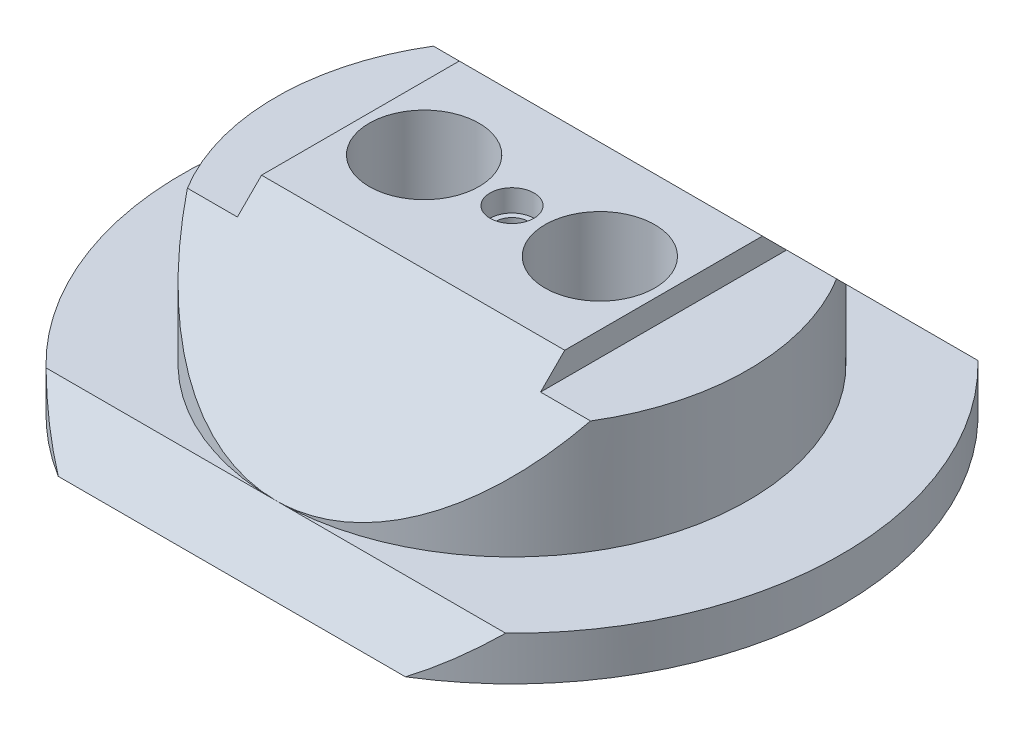
ISO-10303-21;
HEADER;
FILE_DESCRIPTION(('STEP AP214'),'2;1');
FILE_NAME('part.step','',(''),(''),'','','');
FILE_SCHEMA(('AUTOMOTIVE_DESIGN { 1 0 10303 214 1 1 1 1 }'));
ENDSEC;
DATA;
#1=APPLICATION_CONTEXT('core data for automotive mechanical design processes');
#2=APPLICATION_PROTOCOL_DEFINITION('international standard','automotive_design',2000,#1);
#3=PRODUCT_CONTEXT('',#1,'mechanical');
#4=PRODUCT('Part','Part','',(#3));
#5=PRODUCT_RELATED_PRODUCT_CATEGORY('part','',(#4));
#6=PRODUCT_DEFINITION_FORMATION('','',#4);
#7=PRODUCT_DEFINITION_CONTEXT('part definition',#1,'design');
#8=PRODUCT_DEFINITION('design','',#6,#7);
#9=PRODUCT_DEFINITION_SHAPE('','',#8);
#10=(LENGTH_UNIT() NAMED_UNIT(*) SI_UNIT(.MILLI.,.METRE.));
#11=(NAMED_UNIT(*) PLANE_ANGLE_UNIT() SI_UNIT($,.RADIAN.));
#12=(NAMED_UNIT(*) SI_UNIT($,.STERADIAN.) SOLID_ANGLE_UNIT());
#13=UNCERTAINTY_MEASURE_WITH_UNIT(LENGTH_MEASURE(1.E-05),#10,'distance_accuracy_value','');
#14=(GEOMETRIC_REPRESENTATION_CONTEXT(3) GLOBAL_UNCERTAINTY_ASSIGNED_CONTEXT((#13)) GLOBAL_UNIT_ASSIGNED_CONTEXT((#10,
#11,#12)) REPRESENTATION_CONTEXT('',''));
#15=CARTESIAN_POINT('',(0.,0.,0.));
#16=DIRECTION('',(0.,0.,1.));
#17=DIRECTION('',(1.,0.,0.));
#18=AXIS2_PLACEMENT_3D('',#15,#16,#17);
#19=CARTESIAN_POINT('',(0.,20.,0.));
#20=DIRECTION('',(0.,-1.,0.));
#21=DIRECTION('',(0.,0.,-1.));
#22=AXIS2_PLACEMENT_3D('',#19,#20,#21);
#23=CYLINDRICAL_SURFACE('',#22,1.5);
#24=CARTESIAN_POINT('',(0.,0.,0.));
#25=DIRECTION('',(0.,-1.,0.));
#26=DIRECTION('',(0.,0.,-1.));
#27=AXIS2_PLACEMENT_3D('',#24,#25,#26);
#28=CIRCLE('',#27,1.5);
#29=CARTESIAN_POINT('',(0.,0.,-1.5));
#30=VERTEX_POINT('',#29);
#31=EDGE_CURVE('E156',#30,#30,#28,.T.);
#32=ORIENTED_EDGE('',*,*,#31,.T.);
#33=EDGE_LOOP('',(#32));
#34=FACE_BOUND('',#33,.T.);
#35=CARTESIAN_POINT('',(0.,14.5,0.));
#36=DIRECTION('',(0.,1.,0.));
#37=DIRECTION('',(0.,0.,1.));
#38=AXIS2_PLACEMENT_3D('',#35,#36,#37);
#39=CIRCLE('',#38,1.5);
#40=CARTESIAN_POINT('',(0.,14.5,1.5));
#41=VERTEX_POINT('',#40);
#42=EDGE_CURVE('E60',#41,#41,#39,.F.);
#43=ORIENTED_EDGE('',*,*,#42,.F.);
#44=EDGE_LOOP('',(#43));
#45=FACE_BOUND('',#44,.T.);
#46=ADVANCED_FACE('F56',(#34,#45),#23,.F.);
#47=CARTESIAN_POINT('',(0.,0.,0.));
#48=DIRECTION('',(0.,1.,0.));
#49=DIRECTION('',(0.,0.,1.));
#50=AXIS2_PLACEMENT_3D('',#47,#48,#49);
#51=PLANE('',#50);
#52=ORIENTED_EDGE('',*,*,#31,.F.);
#53=EDGE_LOOP('',(#52));
#54=FACE_BOUND('',#53,.T.);
#55=CARTESIAN_POINT('',(-8.,0.,0.));
#56=DIRECTION('',(0.,1.,0.));
#57=DIRECTION('',(0.,0.,1.));
#58=AXIS2_PLACEMENT_3D('',#55,#56,#57);
#59=CIRCLE('',#58,5.);
#60=CARTESIAN_POINT('',(-8.,0.,5.));
#61=VERTEX_POINT('',#60);
#62=EDGE_CURVE('E196',#61,#61,#59,.T.);
#63=ORIENTED_EDGE('',*,*,#62,.T.);
#64=EDGE_LOOP('',(#63));
#65=FACE_BOUND('',#64,.T.);
#66=CARTESIAN_POINT('',(8.,0.,0.));
#67=DIRECTION('',(0.,1.,0.));
#68=DIRECTION('',(0.,0.,1.));
#69=AXIS2_PLACEMENT_3D('',#66,#67,#68);
#70=CIRCLE('',#69,5.);
#71=CARTESIAN_POINT('',(8.,0.,5.));
#72=VERTEX_POINT('',#71);
#73=EDGE_CURVE('E189',#72,#72,#70,.T.);
#74=ORIENTED_EDGE('',*,*,#73,.T.);
#75=EDGE_LOOP('',(#74));
#76=FACE_BOUND('',#75,.T.);
#77=DIRECTION('',(1.,0.,0.));
#78=VECTOR('',#77,1.);
#79=CARTESIAN_POINT('',(0.,0.,25.5));
#80=LINE('',#79,#78);
#81=CARTESIAN_POINT('',(-15.8034806292791,0.,25.5));
#82=VERTEX_POINT('',#81);
#83=CARTESIAN_POINT('',(15.8034806292791,0.,25.5));
#84=VERTEX_POINT('',#83);
#85=EDGE_CURVE('E219',#82,#84,#80,.T.);
#86=ORIENTED_EDGE('',*,*,#85,.F.);
#87=CARTESIAN_POINT('',(0.,0.,0.));
#88=DIRECTION('',(0.,1.,0.));
#89=DIRECTION('',(0.,0.,1.));
#90=AXIS2_PLACEMENT_3D('',#87,#88,#89);
#91=CIRCLE('',#90,30.);
#92=CARTESIAN_POINT('',(-15.8034806292789,0.,-25.5000000000001));
#93=VERTEX_POINT('',#92);
#94=EDGE_CURVE('E249',#93,#82,#91,.T.);
#95=ORIENTED_EDGE('',*,*,#94,.F.);
#96=DIRECTION('',(-1.,0.,0.));
#97=VECTOR('',#96,1.);
#98=CARTESIAN_POINT('',(0.,0.,-25.5000000000001));
#99=LINE('',#98,#97);
#100=CARTESIAN_POINT('',(15.8034806292789,0.,-25.5000000000001));
#101=VERTEX_POINT('',#100);
#102=EDGE_CURVE('E223',#101,#93,#99,.T.);
#103=ORIENTED_EDGE('',*,*,#102,.F.);
#104=EDGE_CURVE('E238',#84,#101,#91,.T.);
#105=ORIENTED_EDGE('',*,*,#104,.F.);
#106=EDGE_LOOP('',(#86,#95,#103,#105));
#107=FACE_BOUND('',#106,.T.);
#108=ADVANCED_FACE('F306',(#54,#65,#76,#107),#51,.F.);
#109=CARTESIAN_POINT('',(0.,4.,0.));
#110=DIRECTION('',(0.,-1.,0.));
#111=DIRECTION('',(0.,0.,-1.));
#112=AXIS2_PLACEMENT_3D('',#109,#110,#111);
#113=CYLINDRICAL_SURFACE('',#112,30.);
#114=CARTESIAN_POINT('',(0.,4.,0.));
#115=DIRECTION('',(0.,1.,0.));
#116=DIRECTION('',(0.,0.,1.));
#117=AXIS2_PLACEMENT_3D('',#114,#115,#116);
#118=CIRCLE('',#117,30.);
#119=CARTESIAN_POINT('',(20.9224759529077,4.,21.5));
#120=VERTEX_POINT('',#119);
#121=CARTESIAN_POINT('',(20.9224759529077,4.,-21.5));
#122=VERTEX_POINT('',#121);
#123=EDGE_CURVE('E212',#120,#122,#118,.T.);
#124=ORIENTED_EDGE('',*,*,#123,.F.);
#125=CARTESIAN_POINT('',(0.,25.4999999999998,0.));
#126=DIRECTION('',(0.,-0.707106781186551,-0.707106781186544));
#127=DIRECTION('',(0.,-0.707106781186544,0.707106781186551));
#128=AXIS2_PLACEMENT_3D('',#125,#126,#127);
#129=ELLIPSE('',#128,42.4264068711926,30.);
#130=EDGE_CURVE('E239',#84,#120,#129,.F.);
#131=ORIENTED_EDGE('',*,*,#130,.F.);
#132=ORIENTED_EDGE('',*,*,#104,.T.);
#133=CARTESIAN_POINT('',(0.,25.4999999999995,0.));
#134=DIRECTION('',(0.,-0.707106781186556,0.707106781186539));
#135=DIRECTION('',(0.,-0.707106781186539,-0.707106781186556));
#136=AXIS2_PLACEMENT_3D('',#133,#134,#135);
#137=ELLIPSE('',#136,42.4264068711924,30.);
#138=EDGE_CURVE('E235',#122,#101,#137,.F.);
#139=ORIENTED_EDGE('',*,*,#138,.F.);
#140=EDGE_LOOP('',(#124,#131,#132,#139));
#141=FACE_BOUND('',#140,.T.);
#142=ADVANCED_FACE('F58',(#141),#113,.T.);
#143=CARTESIAN_POINT('',(0.,4.,0.));
#144=DIRECTION('',(0.,1.,0.));
#145=DIRECTION('',(0.,0.,1.));
#146=AXIS2_PLACEMENT_3D('',#143,#144,#145);
#147=CIRCLE('',#146,30.);
#148=CARTESIAN_POINT('',(-20.9224759529077,4.,-21.5));
#149=VERTEX_POINT('',#148);
#150=CARTESIAN_POINT('',(-20.9224759529077,4.,21.5));
#151=VERTEX_POINT('',#150);
#152=EDGE_CURVE('E209',#149,#151,#147,.T.);
#153=ORIENTED_EDGE('',*,*,#152,.F.);
#154=CARTESIAN_POINT('',(0.,25.4999999999995,0.));
#155=DIRECTION('',(0.,0.707106781186556,-0.707106781186539));
#156=DIRECTION('',(0.,-0.707106781186539,-0.707106781186556));
#157=AXIS2_PLACEMENT_3D('',#154,#155,#156);
#158=ELLIPSE('',#157,42.4264068711924,30.);
#159=EDGE_CURVE('E227',#149,#93,#158,.F.);
#160=ORIENTED_EDGE('',*,*,#159,.T.);
#161=ORIENTED_EDGE('',*,*,#94,.T.);
#162=CARTESIAN_POINT('',(0.,25.4999999999998,0.));
#163=DIRECTION('',(0.,0.707106781186551,0.707106781186544));
#164=DIRECTION('',(0.,-0.707106781186544,0.707106781186551));
#165=AXIS2_PLACEMENT_3D('',#162,#163,#164);
#166=ELLIPSE('',#165,42.4264068711926,30.);
#167=EDGE_CURVE('E230',#82,#151,#166,.F.);
#168=ORIENTED_EDGE('',*,*,#167,.T.);
#169=EDGE_LOOP('',(#153,#160,#161,#168));
#170=FACE_BOUND('',#169,.T.);
#171=ADVANCED_FACE('F315',(#170),#113,.T.);
#172=CARTESIAN_POINT('',(30.001,16.5,8.99999999999987));
#173=DIRECTION('',(0.,-0.707106781186551,-0.707106781186544));
#174=DIRECTION('',(0.,0.707106781186544,-0.707106781186551));
#175=AXIS2_PLACEMENT_3D('',#172,#173,#174);
#176=PLANE('',#175);
#177=DIRECTION('',(1.,0.,0.));
#178=VECTOR('',#177,1.);
#179=CARTESIAN_POINT('',(30.001,4.,21.5));
#180=LINE('',#179,#178);
#181=CARTESIAN_POINT('',(0.,3.99999999999999,21.5));
#182=VERTEX_POINT('',#181);
#183=EDGE_CURVE('E218',#151,#182,#180,.T.);
#184=ORIENTED_EDGE('',*,*,#183,.F.);
#185=ORIENTED_EDGE('',*,*,#167,.F.);
#186=ORIENTED_EDGE('',*,*,#85,.T.);
#187=ORIENTED_EDGE('',*,*,#130,.T.);
#188=EDGE_CURVE('E215',#182,#120,#180,.T.);
#189=ORIENTED_EDGE('',*,*,#188,.F.);
#190=EDGE_LOOP('',(#184,#185,#186,#187,#189));
#191=FACE_BOUND('',#190,.T.);
#192=ADVANCED_FACE('F298',(#191),#176,.F.);
#193=CARTESIAN_POINT('',(30.001,16.5,-8.99999999999971));
#194=DIRECTION('',(0.,-0.707106781186556,0.707106781186539));
#195=DIRECTION('',(0.,-0.707106781186539,-0.707106781186556));
#196=AXIS2_PLACEMENT_3D('',#193,#194,#195);
#197=PLANE('',#196);
#198=DIRECTION('',(-1.,0.,0.));
#199=VECTOR('',#198,1.);
#200=CARTESIAN_POINT('',(30.001,4.,-21.5));
#201=LINE('',#200,#199);
#202=CARTESIAN_POINT('',(0.,4.,-21.5));
#203=VERTEX_POINT('',#202);
#204=EDGE_CURVE('E259',#122,#203,#201,.T.);
#205=ORIENTED_EDGE('',*,*,#204,.F.);
#206=ORIENTED_EDGE('',*,*,#138,.T.);
#207=ORIENTED_EDGE('',*,*,#102,.T.);
#208=ORIENTED_EDGE('',*,*,#159,.F.);
#209=EDGE_CURVE('E256',#203,#149,#201,.T.);
#210=ORIENTED_EDGE('',*,*,#209,.F.);
#211=EDGE_LOOP('',(#205,#206,#207,#208,#210));
#212=FACE_BOUND('',#211,.T.);
#213=ADVANCED_FACE('F313',(#212),#197,.F.);
#214=CARTESIAN_POINT('',(0.,96.0338927753446,0.));
#215=DIRECTION('',(0.,-1.,0.));
#216=DIRECTION('',(0.,0.,-1.));
#217=AXIS2_PLACEMENT_3D('',#214,#215,#216);
#218=CYLINDRICAL_SURFACE('',#217,21.5);
#219=CARTESIAN_POINT('',(0.,14.3,0.));
#220=DIRECTION('',(0.,-1.,0.));
#221=DIRECTION('',(1.,0.,0.));
#222=AXIS2_PLACEMENT_3D('',#219,#220,#221);
#223=CIRCLE('',#222,21.5);
#224=CARTESIAN_POINT('',(18.3523840413175,14.3,-11.1999999999998));
#225=VERTEX_POINT('',#224);
#226=CARTESIAN_POINT('',(18.3523840413174,14.3,11.1999999999999));
#227=VERTEX_POINT('',#226);
#228=EDGE_CURVE('E177',#225,#227,#223,.T.);
#229=ORIENTED_EDGE('',*,*,#228,.T.);
#230=CARTESIAN_POINT('',(0.,25.4999999999998,0.));
#231=DIRECTION('',(0.,-0.707106781186551,-0.707106781186544));
#232=DIRECTION('',(0.,-0.707106781186544,0.707106781186551));
#233=AXIS2_PLACEMENT_3D('',#230,#231,#232);
#234=ELLIPSE('',#233,30.4055915910214,21.5);
#235=EDGE_CURVE('E208',#182,#227,#234,.F.);
#236=ORIENTED_EDGE('',*,*,#235,.F.);
#237=CARTESIAN_POINT('',(0.,4.,0.));
#238=DIRECTION('',(0.,1.,0.));
#239=DIRECTION('',(0.,0.,1.));
#240=AXIS2_PLACEMENT_3D('',#237,#238,#239);
#241=CIRCLE('',#240,21.5);
#242=EDGE_CURVE('E201',#182,#203,#241,.T.);
#243=ORIENTED_EDGE('',*,*,#242,.T.);
#244=CARTESIAN_POINT('',(0.,25.4999999999995,0.));
#245=DIRECTION('',(0.,-0.707106781186556,0.707106781186539));
#246=DIRECTION('',(0.,-0.707106781186539,-0.707106781186556));
#247=AXIS2_PLACEMENT_3D('',#244,#245,#246);
#248=ELLIPSE('',#247,30.4055915910212,21.5);
#249=EDGE_CURVE('E253',#225,#203,#248,.F.);
#250=ORIENTED_EDGE('',*,*,#249,.F.);
#251=EDGE_LOOP('',(#229,#236,#243,#250));
#252=FACE_BOUND('',#251,.T.);
#253=ADVANCED_FACE('F289',(#252),#218,.T.);
#254=CARTESIAN_POINT('',(0.,4.,0.));
#255=DIRECTION('',(0.,1.,0.));
#256=DIRECTION('',(0.,0.,1.));
#257=AXIS2_PLACEMENT_3D('',#254,#255,#256);
#258=PLANE('',#257);
#259=ORIENTED_EDGE('',*,*,#188,.T.);
#260=ORIENTED_EDGE('',*,*,#123,.T.);
#261=ORIENTED_EDGE('',*,*,#204,.T.);
#262=ORIENTED_EDGE('',*,*,#242,.F.);
#263=EDGE_LOOP('',(#259,#260,#261,#262));
#264=FACE_BOUND('',#263,.T.);
#265=ADVANCED_FACE('F295',(#264),#258,.T.);
#266=ORIENTED_EDGE('',*,*,#183,.T.);
#267=EDGE_CURVE('E200',#203,#182,#241,.T.);
#268=ORIENTED_EDGE('',*,*,#267,.F.);
#269=ORIENTED_EDGE('',*,*,#209,.T.);
#270=ORIENTED_EDGE('',*,*,#152,.T.);
#271=EDGE_LOOP('',(#266,#268,#269,#270));
#272=FACE_BOUND('',#271,.T.);
#273=ADVANCED_FACE('F282',(#272),#258,.T.);
#274=CARTESIAN_POINT('',(-18.3523840413174,14.3,11.1999999999999));
#275=VERTEX_POINT('',#274);
#276=EDGE_CURVE('E205',#275,#182,#234,.F.);
#277=ORIENTED_EDGE('',*,*,#276,.F.);
#278=CARTESIAN_POINT('',(0.,14.3,0.));
#279=DIRECTION('',(0.,-1.,0.));
#280=DIRECTION('',(0.,0.,-1.));
#281=AXIS2_PLACEMENT_3D('',#278,#279,#280);
#282=CIRCLE('',#281,21.5);
#283=CARTESIAN_POINT('',(-18.3523840413175,14.3,-11.1999999999998));
#284=VERTEX_POINT('',#283);
#285=EDGE_CURVE('E73',#275,#284,#282,.T.);
#286=ORIENTED_EDGE('',*,*,#285,.T.);
#287=EDGE_CURVE('E161',#203,#284,#248,.F.);
#288=ORIENTED_EDGE('',*,*,#287,.F.);
#289=ORIENTED_EDGE('',*,*,#267,.T.);
#290=EDGE_LOOP('',(#277,#286,#288,#289));
#291=FACE_BOUND('',#290,.T.);
#292=ADVANCED_FACE('F274',(#291),#218,.T.);
#293=DIRECTION('',(1.,0.,0.));
#294=VECTOR('',#293,1.);
#295=CARTESIAN_POINT('',(30.001,14.3,-11.1999999999998));
#296=LINE('',#295,#294);
#297=CARTESIAN_POINT('',(-13.8,14.3,-11.1999999999998));
#298=VERTEX_POINT('',#297);
#299=EDGE_CURVE('E152',#284,#298,#296,.T.);
#300=ORIENTED_EDGE('',*,*,#299,.T.);
#301=DIRECTION('',(0.,0.707106781186539,0.707106781186556));
#302=VECTOR('',#301,1.);
#303=CARTESIAN_POINT('',(-13.8,16.5,-8.99999999999971));
#304=LINE('',#303,#302);
#305=CARTESIAN_POINT('',(-13.8,16.5,-8.99999999999971));
#306=VERTEX_POINT('',#305);
#307=EDGE_CURVE('E141',#298,#306,#304,.T.);
#308=ORIENTED_EDGE('',*,*,#307,.T.);
#309=DIRECTION('',(-1.,0.,0.));
#310=VECTOR('',#309,1.);
#311=CARTESIAN_POINT('',(30.001,16.5,-8.99999999999971));
#312=LINE('',#311,#310);
#313=CARTESIAN_POINT('',(13.8,16.5,-8.99999999999971));
#314=VERTEX_POINT('',#313);
#315=EDGE_CURVE('E243',#314,#306,#312,.T.);
#316=ORIENTED_EDGE('',*,*,#315,.F.);
#317=DIRECTION('',(0.,-0.707106781186539,-0.707106781186556));
#318=VECTOR('',#317,1.);
#319=CARTESIAN_POINT('',(13.8,16.5,-8.99999999999971));
#320=LINE('',#319,#318);
#321=CARTESIAN_POINT('',(13.8,14.3,-11.1999999999998));
#322=VERTEX_POINT('',#321);
#323=EDGE_CURVE('E171',#314,#322,#320,.T.);
#324=ORIENTED_EDGE('',*,*,#323,.T.);
#325=DIRECTION('',(1.,0.,0.));
#326=VECTOR('',#325,1.);
#327=CARTESIAN_POINT('',(30.001,14.3,-11.1999999999998));
#328=LINE('',#327,#326);
#329=EDGE_CURVE('E180',#322,#225,#328,.T.);
#330=ORIENTED_EDGE('',*,*,#329,.T.);
#331=ORIENTED_EDGE('',*,*,#249,.T.);
#332=ORIENTED_EDGE('',*,*,#287,.T.);
#333=EDGE_LOOP('',(#300,#308,#316,#324,#330,#331,#332));
#334=FACE_BOUND('',#333,.T.);
#335=ADVANCED_FACE('F159',(#334),#197,.F.);
#336=CARTESIAN_POINT('',(30.001,16.5,8.99999999999987));
#337=DIRECTION('',(0.,-1.,0.));
#338=DIRECTION('',(0.,0.,-1.));
#339=AXIS2_PLACEMENT_3D('',#336,#337,#338);
#340=PLANE('',#339);
#341=CARTESIAN_POINT('',(0.,16.5,0.));
#342=DIRECTION('',(0.,1.,0.));
#343=DIRECTION('',(0.,0.,1.));
#344=AXIS2_PLACEMENT_3D('',#341,#342,#343);
#345=CIRCLE('',#344,2.);
#346=CARTESIAN_POINT('',(0.,16.5,2.00000000000001));
#347=VERTEX_POINT('',#346);
#348=EDGE_CURVE('E466',#347,#347,#345,.T.);
#349=ORIENTED_EDGE('',*,*,#348,.F.);
#350=EDGE_LOOP('',(#349));
#351=FACE_BOUND('',#350,.T.);
#352=CARTESIAN_POINT('',(-8.,16.5,0.));
#353=DIRECTION('',(0.,1.,0.));
#354=DIRECTION('',(0.,0.,1.));
#355=AXIS2_PLACEMENT_3D('',#352,#353,#354);
#356=CIRCLE('',#355,5.);
#357=CARTESIAN_POINT('',(-8.,16.5,5.00000000000001));
#358=VERTEX_POINT('',#357);
#359=EDGE_CURVE('E185',#358,#358,#356,.T.);
#360=ORIENTED_EDGE('',*,*,#359,.F.);
#361=EDGE_LOOP('',(#360));
#362=FACE_BOUND('',#361,.T.);
#363=CARTESIAN_POINT('',(8.,16.5,0.));
#364=DIRECTION('',(0.,1.,0.));
#365=DIRECTION('',(0.,0.,1.));
#366=AXIS2_PLACEMENT_3D('',#363,#364,#365);
#367=CIRCLE('',#366,5.);
#368=CARTESIAN_POINT('',(8.,16.5,5.));
#369=VERTEX_POINT('',#368);
#370=EDGE_CURVE('E184',#369,#369,#367,.T.);
#371=ORIENTED_EDGE('',*,*,#370,.F.);
#372=EDGE_LOOP('',(#371));
#373=FACE_BOUND('',#372,.T.);
#374=ORIENTED_EDGE('',*,*,#315,.T.);
#375=DIRECTION('',(0.,0.,1.));
#376=VECTOR('',#375,1.);
#377=CARTESIAN_POINT('',(-13.8,16.5,-25.5000000000001));
#378=LINE('',#377,#376);
#379=CARTESIAN_POINT('',(-13.8,16.5,8.99999999999986));
#380=VERTEX_POINT('',#379);
#381=EDGE_CURVE('E146',#306,#380,#378,.T.);
#382=ORIENTED_EDGE('',*,*,#381,.T.);
#383=DIRECTION('',(-1.,0.,0.));
#384=VECTOR('',#383,1.);
#385=CARTESIAN_POINT('',(30.001,16.5,8.99999999999987));
#386=LINE('',#385,#384);
#387=CARTESIAN_POINT('',(13.8,16.5,8.99999999999987));
#388=VERTEX_POINT('',#387);
#389=EDGE_CURVE('E234',#388,#380,#386,.T.);
#390=ORIENTED_EDGE('',*,*,#389,.F.);
#391=DIRECTION('',(0.,0.,1.));
#392=VECTOR('',#391,1.);
#393=CARTESIAN_POINT('',(13.8,16.5,-25.5000000000001));
#394=LINE('',#393,#392);
#395=EDGE_CURVE('E81',#314,#388,#394,.T.);
#396=ORIENTED_EDGE('',*,*,#395,.F.);
#397=EDGE_LOOP('',(#374,#382,#390,#396));
#398=FACE_BOUND('',#397,.T.);
#399=ADVANCED_FACE('F360',(#351,#362,#373,#398),#340,.F.);
#400=ORIENTED_EDGE('',*,*,#389,.T.);
#401=DIRECTION('',(0.,-0.707106781186544,0.707106781186551));
#402=VECTOR('',#401,1.);
#403=CARTESIAN_POINT('',(-13.8,16.5,8.99999999999987));
#404=LINE('',#403,#402);
#405=CARTESIAN_POINT('',(-13.8,14.3,11.1999999999999));
#406=VERTEX_POINT('',#405);
#407=EDGE_CURVE('E13',#380,#406,#404,.T.);
#408=ORIENTED_EDGE('',*,*,#407,.T.);
#409=DIRECTION('',(-1.,0.,0.));
#410=VECTOR('',#409,1.);
#411=CARTESIAN_POINT('',(30.001,14.3,11.1999999999999));
#412=LINE('',#411,#410);
#413=EDGE_CURVE('E66',#406,#275,#412,.T.);
#414=ORIENTED_EDGE('',*,*,#413,.T.);
#415=ORIENTED_EDGE('',*,*,#276,.T.);
#416=ORIENTED_EDGE('',*,*,#235,.T.);
#417=DIRECTION('',(-1.,0.,0.));
#418=VECTOR('',#417,1.);
#419=CARTESIAN_POINT('',(30.001,14.3,11.1999999999999));
#420=LINE('',#419,#418);
#421=CARTESIAN_POINT('',(13.8,14.3,11.1999999999999));
#422=VERTEX_POINT('',#421);
#423=EDGE_CURVE('E263',#227,#422,#420,.T.);
#424=ORIENTED_EDGE('',*,*,#423,.T.);
#425=DIRECTION('',(0.,0.707106781186544,-0.707106781186551));
#426=VECTOR('',#425,1.);
#427=CARTESIAN_POINT('',(13.8,16.5,8.99999999999987));
#428=LINE('',#427,#426);
#429=EDGE_CURVE('E260',#422,#388,#428,.T.);
#430=ORIENTED_EDGE('',*,*,#429,.T.);
#431=EDGE_LOOP('',(#400,#408,#414,#415,#416,#424,#430));
#432=FACE_BOUND('',#431,.T.);
#433=ADVANCED_FACE('F270',(#432),#176,.F.);
#434=CARTESIAN_POINT('',(8.,-7.50000000000001,0.));
#435=DIRECTION('',(0.,1.,0.));
#436=DIRECTION('',(0.,0.,1.));
#437=AXIS2_PLACEMENT_3D('',#434,#435,#436);
#438=CYLINDRICAL_SURFACE('',#437,5.);
#439=ORIENTED_EDGE('',*,*,#370,.T.);
#440=EDGE_LOOP('',(#439));
#441=FACE_BOUND('',#440,.T.);
#442=ORIENTED_EDGE('',*,*,#73,.F.);
#443=EDGE_LOOP('',(#442));
#444=FACE_BOUND('',#443,.T.);
#445=ADVANCED_FACE('F350',(#441,#444),#438,.F.);
#446=CARTESIAN_POINT('',(-8.,-7.50000000000001,0.));
#447=DIRECTION('',(0.,1.,0.));
#448=DIRECTION('',(0.,0.,1.));
#449=AXIS2_PLACEMENT_3D('',#446,#447,#448);
#450=CYLINDRICAL_SURFACE('',#449,5.);
#451=ORIENTED_EDGE('',*,*,#359,.T.);
#452=EDGE_LOOP('',(#451));
#453=FACE_BOUND('',#452,.T.);
#454=ORIENTED_EDGE('',*,*,#62,.F.);
#455=EDGE_LOOP('',(#454));
#456=FACE_BOUND('',#455,.T.);
#457=ADVANCED_FACE('F344',(#453,#456),#450,.F.);
#458=CARTESIAN_POINT('',(21.5,14.3,-25.5000000000001));
#459=DIRECTION('',(0.,-1.,0.));
#460=DIRECTION('',(1.,0.,0.));
#461=AXIS2_PLACEMENT_3D('',#458,#459,#460);
#462=PLANE('',#461);
#463=DIRECTION('',(0.,0.,1.));
#464=VECTOR('',#463,1.);
#465=CARTESIAN_POINT('',(13.8,14.3,-25.5000000000001));
#466=LINE('',#465,#464);
#467=EDGE_CURVE('E167',#322,#422,#466,.T.);
#468=ORIENTED_EDGE('',*,*,#467,.T.);
#469=ORIENTED_EDGE('',*,*,#423,.F.);
#470=ORIENTED_EDGE('',*,*,#228,.F.);
#471=ORIENTED_EDGE('',*,*,#329,.F.);
#472=EDGE_LOOP('',(#468,#469,#470,#471));
#473=FACE_BOUND('',#472,.T.);
#474=ADVANCED_FACE('F341',(#473),#462,.F.);
#475=CARTESIAN_POINT('',(13.8,14.3,-25.5000000000001));
#476=DIRECTION('',(-1.,0.,0.));
#477=DIRECTION('',(0.,0.,1.));
#478=AXIS2_PLACEMENT_3D('',#475,#476,#477);
#479=PLANE('',#478);
#480=ORIENTED_EDGE('',*,*,#395,.T.);
#481=ORIENTED_EDGE('',*,*,#429,.F.);
#482=ORIENTED_EDGE('',*,*,#467,.F.);
#483=ORIENTED_EDGE('',*,*,#323,.F.);
#484=EDGE_LOOP('',(#480,#481,#482,#483));
#485=FACE_BOUND('',#484,.T.);
#486=ADVANCED_FACE('F337',(#485),#479,.F.);
#487=CARTESIAN_POINT('',(-13.8,14.3,-25.5000000000001));
#488=DIRECTION('',(1.,0.,0.));
#489=DIRECTION('',(0.,0.,-1.));
#490=AXIS2_PLACEMENT_3D('',#487,#488,#489);
#491=PLANE('',#490);
#492=DIRECTION('',(0.,0.,1.));
#493=VECTOR('',#492,1.);
#494=CARTESIAN_POINT('',(-13.8,14.3,-25.5000000000001));
#495=LINE('',#494,#493);
#496=EDGE_CURVE('E144',#298,#406,#495,.T.);
#497=ORIENTED_EDGE('',*,*,#496,.T.);
#498=ORIENTED_EDGE('',*,*,#407,.F.);
#499=ORIENTED_EDGE('',*,*,#381,.F.);
#500=ORIENTED_EDGE('',*,*,#307,.F.);
#501=EDGE_LOOP('',(#497,#498,#499,#500));
#502=FACE_BOUND('',#501,.T.);
#503=ADVANCED_FACE('F143',(#502),#491,.F.);
#504=CARTESIAN_POINT('',(-21.5,14.3,-25.5000000000001));
#505=DIRECTION('',(0.,-1.,0.));
#506=DIRECTION('',(0.,0.,-1.));
#507=AXIS2_PLACEMENT_3D('',#504,#505,#506);
#508=PLANE('',#507);
#509=ORIENTED_EDGE('',*,*,#285,.F.);
#510=ORIENTED_EDGE('',*,*,#413,.F.);
#511=ORIENTED_EDGE('',*,*,#496,.F.);
#512=ORIENTED_EDGE('',*,*,#299,.F.);
#513=EDGE_LOOP('',(#509,#510,#511,#512));
#514=FACE_BOUND('',#513,.T.);
#515=ADVANCED_FACE('F154',(#514),#508,.F.);
#516=CARTESIAN_POINT('',(0.,14.5,0.));
#517=DIRECTION('',(0.,1.,0.));
#518=DIRECTION('',(0.,0.,1.));
#519=AXIS2_PLACEMENT_3D('',#516,#517,#518);
#520=PLANE('',#519);
#521=CARTESIAN_POINT('',(0.,14.5,0.));
#522=DIRECTION('',(0.,1.,0.));
#523=DIRECTION('',(0.,0.,1.));
#524=AXIS2_PLACEMENT_3D('',#521,#522,#523);
#525=CIRCLE('',#524,2.);
#526=CARTESIAN_POINT('',(0.,14.5,2.00000000000001));
#527=VERTEX_POINT('',#526);
#528=EDGE_CURVE('E463',#527,#527,#525,.T.);
#529=ORIENTED_EDGE('',*,*,#528,.T.);
#530=EDGE_LOOP('',(#529));
#531=FACE_BOUND('',#530,.T.);
#532=ORIENTED_EDGE('',*,*,#42,.T.);
#533=EDGE_LOOP('',(#532));
#534=FACE_BOUND('',#533,.T.);
#535=ADVANCED_FACE('F340',(#531,#534),#520,.T.);
#536=CARTESIAN_POINT('',(0.,14.5,0.));
#537=DIRECTION('',(0.,1.,0.));
#538=DIRECTION('',(0.,0.,1.));
#539=AXIS2_PLACEMENT_3D('',#536,#537,#538);
#540=CYLINDRICAL_SURFACE('',#539,2.);
#541=ORIENTED_EDGE('',*,*,#528,.F.);
#542=EDGE_LOOP('',(#541));
#543=FACE_BOUND('',#542,.T.);
#544=ORIENTED_EDGE('',*,*,#348,.T.);
#545=EDGE_LOOP('',(#544));
#546=FACE_BOUND('',#545,.T.);
#547=ADVANCED_FACE('F333',(#543,#546),#540,.F.);
#548=CLOSED_SHELL('',(#46,#108,#142,#171,#192,#213,#253,#265,#273,#292,#335,#399,#433,#445,#457,
#474,#486,#503,#515,#535,#547));
#549=MANIFOLD_SOLID_BREP('B2',#548);
#550=ADVANCED_BREP_SHAPE_REPRESENTATION('',(#18,#549),#14);
#551=SHAPE_DEFINITION_REPRESENTATION(#9,#550);
ENDSEC;
END-ISO-10303-21;
